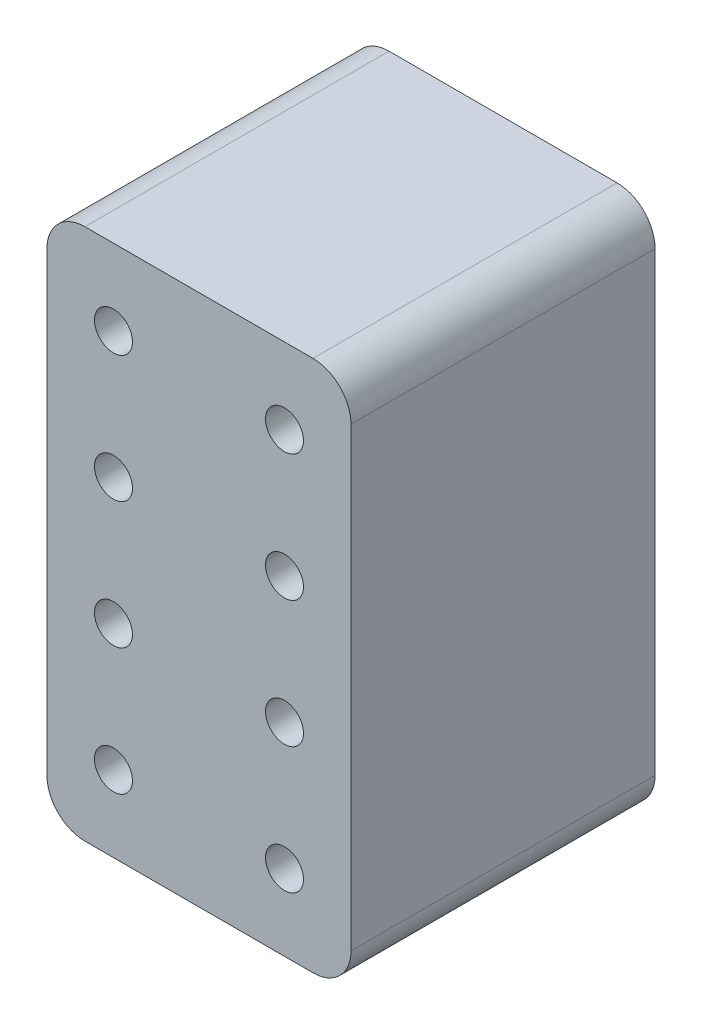
ISO-10303-21;
HEADER;
FILE_DESCRIPTION(('STEP AP214'),'2;1');
FILE_NAME('part.step','',(''),(''),'','','');
FILE_SCHEMA(('AUTOMOTIVE_DESIGN { 1 0 10303 214 1 1 1 1 }'));
ENDSEC;
DATA;
#1=APPLICATION_CONTEXT('core data for automotive mechanical design processes');
#2=APPLICATION_PROTOCOL_DEFINITION('international standard','automotive_design',2000,#1);
#3=PRODUCT_CONTEXT('',#1,'mechanical');
#4=PRODUCT('Part','Part','',(#3));
#5=PRODUCT_RELATED_PRODUCT_CATEGORY('part','',(#4));
#6=PRODUCT_DEFINITION_FORMATION('','',#4);
#7=PRODUCT_DEFINITION_CONTEXT('part definition',#1,'design');
#8=PRODUCT_DEFINITION('design','',#6,#7);
#9=PRODUCT_DEFINITION_SHAPE('','',#8);
#10=(LENGTH_UNIT() NAMED_UNIT(*) SI_UNIT(.MILLI.,.METRE.));
#11=(NAMED_UNIT(*) PLANE_ANGLE_UNIT() SI_UNIT($,.RADIAN.));
#12=(NAMED_UNIT(*) SI_UNIT($,.STERADIAN.) SOLID_ANGLE_UNIT());
#13=UNCERTAINTY_MEASURE_WITH_UNIT(LENGTH_MEASURE(1.E-05),#10,'distance_accuracy_value','');
#14=(GEOMETRIC_REPRESENTATION_CONTEXT(3) GLOBAL_UNCERTAINTY_ASSIGNED_CONTEXT((#13)) GLOBAL_UNIT_ASSIGNED_CONTEXT((#10,
#11,#12)) REPRESENTATION_CONTEXT('',''));
#15=CARTESIAN_POINT('',(0.,0.,0.));
#16=DIRECTION('',(0.,0.,1.));
#17=DIRECTION('',(1.,0.,0.));
#18=AXIS2_PLACEMENT_3D('',#15,#16,#17);
#19=CARTESIAN_POINT('',(-11.9999999999992,-24.0000000000001,32.));
#20=DIRECTION('',(0.,0.,-1.));
#21=DIRECTION('',(-1.,0.,0.));
#22=AXIS2_PLACEMENT_3D('',#19,#20,#21);
#23=PLANE('',#22);
#24=CARTESIAN_POINT('',(-11.9999999999992,-24.0000000000001,32.));
#25=DIRECTION('',(0.,0.,1.));
#26=DIRECTION('',(-1.,0.,0.));
#27=AXIS2_PLACEMENT_3D('',#24,#25,#26);
#28=CIRCLE('',#27,4.);
#29=CARTESIAN_POINT('',(-15.9999999999992,-24.0000000000001,32.));
#30=VERTEX_POINT('',#29);
#31=CARTESIAN_POINT('',(-11.9999999999991,-28.0000000000001,32.));
#32=VERTEX_POINT('',#31);
#33=EDGE_CURVE('E164',#30,#32,#28,.T.);
#34=ORIENTED_EDGE('',*,*,#33,.T.);
#35=DIRECTION('',(1.,0.,0.));
#36=VECTOR('',#35,1.);
#37=CARTESIAN_POINT('',(12.0000000000009,-27.9999999999999,32.));
#38=LINE('',#37,#36);
#39=CARTESIAN_POINT('',(12.0000000000009,-27.9999999999999,32.));
#40=VERTEX_POINT('',#39);
#41=EDGE_CURVE('E100',#32,#40,#38,.T.);
#42=ORIENTED_EDGE('',*,*,#41,.T.);
#43=CARTESIAN_POINT('',(12.0000000000008,-23.9999999999999,32.));
#44=DIRECTION('',(0.,0.,1.));
#45=DIRECTION('',(-1.,0.,0.));
#46=AXIS2_PLACEMENT_3D('',#43,#44,#45);
#47=CIRCLE('',#46,4.);
#48=CARTESIAN_POINT('',(16.0000000000008,-23.9999999999999,32.));
#49=VERTEX_POINT('',#48);
#50=EDGE_CURVE('E185',#40,#49,#47,.T.);
#51=ORIENTED_EDGE('',*,*,#50,.T.);
#52=DIRECTION('',(0.,1.,0.));
#53=VECTOR('',#52,1.);
#54=CARTESIAN_POINT('',(16.0000000000008,24.0000000000001,32.));
#55=LINE('',#54,#53);
#56=CARTESIAN_POINT('',(16.0000000000008,24.0000000000001,32.));
#57=VERTEX_POINT('',#56);
#58=EDGE_CURVE('E199',#49,#57,#55,.T.);
#59=ORIENTED_EDGE('',*,*,#58,.T.);
#60=CARTESIAN_POINT('',(12.0000000000008,24.0000000000001,32.));
#61=DIRECTION('',(0.,0.,1.));
#62=DIRECTION('',(-1.,0.,0.));
#63=AXIS2_PLACEMENT_3D('',#60,#61,#62);
#64=CIRCLE('',#63,4.);
#65=CARTESIAN_POINT('',(12.0000000000008,28.0000000000001,32.));
#66=VERTEX_POINT('',#65);
#67=EDGE_CURVE('E119',#57,#66,#64,.T.);
#68=ORIENTED_EDGE('',*,*,#67,.T.);
#69=DIRECTION('',(-1.,0.,0.));
#70=VECTOR('',#69,1.);
#71=CARTESIAN_POINT('',(12.0000000000008,28.0000000000001,32.));
#72=LINE('',#71,#70);
#73=CARTESIAN_POINT('',(-11.9999999999992,27.9999999999999,32.));
#74=VERTEX_POINT('',#73);
#75=EDGE_CURVE('E113',#66,#74,#72,.T.);
#76=ORIENTED_EDGE('',*,*,#75,.T.);
#77=CARTESIAN_POINT('',(-11.9999999999992,23.9999999999999,32.));
#78=DIRECTION('',(0.,0.,1.));
#79=DIRECTION('',(1.,0.,0.));
#80=AXIS2_PLACEMENT_3D('',#77,#78,#79);
#81=CIRCLE('',#80,4.);
#82=CARTESIAN_POINT('',(-15.9999999999992,23.9999999999999,32.));
#83=VERTEX_POINT('',#82);
#84=EDGE_CURVE('E117',#74,#83,#81,.T.);
#85=ORIENTED_EDGE('',*,*,#84,.T.);
#86=DIRECTION('',(0.,-1.,0.));
#87=VECTOR('',#86,1.);
#88=CARTESIAN_POINT('',(-15.9999999999992,23.9999999999999,32.));
#89=LINE('',#88,#87);
#90=EDGE_CURVE('E57',#83,#30,#89,.T.);
#91=ORIENTED_EDGE('',*,*,#90,.T.);
#92=EDGE_LOOP('',(#34,#42,#51,#59,#68,#76,#85,#91));
#93=FACE_BOUND('',#92,.T.);
#94=CARTESIAN_POINT('',(8.99999999999912,20.0000000000001,32.));
#95=DIRECTION('',(0.,0.,1.));
#96=DIRECTION('',(1.,0.,0.));
#97=AXIS2_PLACEMENT_3D('',#94,#95,#96);
#98=CIRCLE('',#97,2.00000000000079);
#99=CARTESIAN_POINT('',(10.9999999999999,20.0000000000001,32.));
#100=VERTEX_POINT('',#99);
#101=EDGE_CURVE('E146',#100,#100,#98,.T.);
#102=ORIENTED_EDGE('',*,*,#101,.F.);
#103=EDGE_LOOP('',(#102));
#104=FACE_BOUND('',#103,.T.);
#105=CARTESIAN_POINT('',(9.00000000000014,6.66666666666695,32.));
#106=DIRECTION('',(0.,0.,1.));
#107=DIRECTION('',(1.,0.,0.));
#108=AXIS2_PLACEMENT_3D('',#105,#106,#107);
#109=CIRCLE('',#108,2.);
#110=CARTESIAN_POINT('',(11.0000000000001,6.66666666666695,32.));
#111=VERTEX_POINT('',#110);
#112=EDGE_CURVE('E213',#111,#111,#109,.T.);
#113=ORIENTED_EDGE('',*,*,#112,.F.);
#114=EDGE_LOOP('',(#113));
#115=FACE_BOUND('',#114,.T.);
#116=CARTESIAN_POINT('',(9.00000000000028,-6.66666666666638,32.));
#117=DIRECTION('',(0.,0.,1.));
#118=DIRECTION('',(1.,0.,0.));
#119=AXIS2_PLACEMENT_3D('',#116,#117,#118);
#120=CIRCLE('',#119,2.);
#121=CARTESIAN_POINT('',(11.0000000000003,-6.66666666666638,32.));
#122=VERTEX_POINT('',#121);
#123=EDGE_CURVE('E221',#122,#122,#120,.T.);
#124=ORIENTED_EDGE('',*,*,#123,.F.);
#125=EDGE_LOOP('',(#124));
#126=FACE_BOUND('',#125,.T.);
#127=CARTESIAN_POINT('',(8.99999999999911,-19.9999999999999,32.));
#128=DIRECTION('',(0.,0.,1.));
#129=DIRECTION('',(1.,0.,0.));
#130=AXIS2_PLACEMENT_3D('',#127,#128,#129);
#131=CIRCLE('',#130,2.00000000000025);
#132=CARTESIAN_POINT('',(10.9999999999994,-19.9999999999999,32.));
#133=VERTEX_POINT('',#132);
#134=EDGE_CURVE('E229',#133,#133,#131,.T.);
#135=ORIENTED_EDGE('',*,*,#134,.F.);
#136=EDGE_LOOP('',(#135));
#137=FACE_BOUND('',#136,.T.);
#138=CARTESIAN_POINT('',(-8.99999999999937,-19.9999999999999,32.));
#139=DIRECTION('',(0.,0.,1.));
#140=DIRECTION('',(-1.,0.,0.));
#141=AXIS2_PLACEMENT_3D('',#138,#139,#140);
#142=CIRCLE('',#141,2.);
#143=CARTESIAN_POINT('',(-10.9999999999994,-19.9999999999999,32.));
#144=VERTEX_POINT('',#143);
#145=EDGE_CURVE('E237',#144,#144,#142,.T.);
#146=ORIENTED_EDGE('',*,*,#145,.F.);
#147=EDGE_LOOP('',(#146));
#148=FACE_BOUND('',#147,.T.);
#149=CARTESIAN_POINT('',(-9.00000000000028,-6.66666666666638,32.));
#150=DIRECTION('',(0.,0.,1.));
#151=DIRECTION('',(-1.,0.,0.));
#152=AXIS2_PLACEMENT_3D('',#149,#150,#151);
#153=CIRCLE('',#152,2.);
#154=CARTESIAN_POINT('',(-11.0000000000003,-6.66666666666638,32.));
#155=VERTEX_POINT('',#154);
#156=EDGE_CURVE('E245',#155,#155,#153,.T.);
#157=ORIENTED_EDGE('',*,*,#156,.F.);
#158=EDGE_LOOP('',(#157));
#159=FACE_BOUND('',#158,.T.);
#160=CARTESIAN_POINT('',(-9.00000000000014,6.66666666666695,32.));
#161=DIRECTION('',(0.,0.,1.));
#162=DIRECTION('',(-1.,0.,0.));
#163=AXIS2_PLACEMENT_3D('',#160,#161,#162);
#164=CIRCLE('',#163,2.);
#165=CARTESIAN_POINT('',(-11.0000000000001,6.66666666666695,32.));
#166=VERTEX_POINT('',#165);
#167=EDGE_CURVE('E253',#166,#166,#164,.T.);
#168=ORIENTED_EDGE('',*,*,#167,.F.);
#169=EDGE_LOOP('',(#168));
#170=FACE_BOUND('',#169,.T.);
#171=CARTESIAN_POINT('',(-9.,20.0000000000003,32.));
#172=DIRECTION('',(0.,0.,1.));
#173=DIRECTION('',(-1.,0.,0.));
#174=AXIS2_PLACEMENT_3D('',#171,#172,#173);
#175=CIRCLE('',#174,1.99999999999996);
#176=CARTESIAN_POINT('',(-11.,20.0000000000003,32.));
#177=VERTEX_POINT('',#176);
#178=EDGE_CURVE('E261',#177,#177,#175,.T.);
#179=ORIENTED_EDGE('',*,*,#178,.F.);
#180=EDGE_LOOP('',(#179));
#181=FACE_BOUND('',#180,.T.);
#182=ADVANCED_FACE('F39',(#93,#104,#115,#126,#137,#148,#159,#170,#181),#23,.F.);
#183=CARTESIAN_POINT('',(-11.9999999999992,-24.0000000000001,0.));
#184=DIRECTION('',(0.,0.,-1.));
#185=DIRECTION('',(-1.,0.,0.));
#186=AXIS2_PLACEMENT_3D('',#183,#184,#185);
#187=PLANE('',#186);
#188=CARTESIAN_POINT('',(-9.00000000000014,6.66666666666695,0.));
#189=DIRECTION('',(0.,0.,1.));
#190=DIRECTION('',(-1.,0.,0.));
#191=AXIS2_PLACEMENT_3D('',#188,#189,#190);
#192=CIRCLE('',#191,2.);
#193=CARTESIAN_POINT('',(-11.0000000000001,6.66666666666695,0.));
#194=VERTEX_POINT('',#193);
#195=EDGE_CURVE('E257',#194,#194,#192,.T.);
#196=ORIENTED_EDGE('',*,*,#195,.T.);
#197=EDGE_LOOP('',(#196));
#198=FACE_BOUND('',#197,.T.);
#199=CARTESIAN_POINT('',(-8.99999999999937,-19.9999999999999,0.));
#200=DIRECTION('',(0.,0.,1.));
#201=DIRECTION('',(-1.,0.,0.));
#202=AXIS2_PLACEMENT_3D('',#199,#200,#201);
#203=CIRCLE('',#202,2.);
#204=CARTESIAN_POINT('',(-10.9999999999994,-19.9999999999999,0.));
#205=VERTEX_POINT('',#204);
#206=EDGE_CURVE('E241',#205,#205,#203,.T.);
#207=ORIENTED_EDGE('',*,*,#206,.T.);
#208=EDGE_LOOP('',(#207));
#209=FACE_BOUND('',#208,.T.);
#210=CARTESIAN_POINT('',(9.00000000000028,-6.66666666666638,0.));
#211=DIRECTION('',(0.,0.,1.));
#212=DIRECTION('',(1.,0.,0.));
#213=AXIS2_PLACEMENT_3D('',#210,#211,#212);
#214=CIRCLE('',#213,2.);
#215=CARTESIAN_POINT('',(11.0000000000003,-6.66666666666638,0.));
#216=VERTEX_POINT('',#215);
#217=EDGE_CURVE('E225',#216,#216,#214,.T.);
#218=ORIENTED_EDGE('',*,*,#217,.T.);
#219=EDGE_LOOP('',(#218));
#220=FACE_BOUND('',#219,.T.);
#221=CARTESIAN_POINT('',(8.99999999999912,20.0000000000001,0.));
#222=DIRECTION('',(0.,0.,1.));
#223=DIRECTION('',(1.,0.,0.));
#224=AXIS2_PLACEMENT_3D('',#221,#222,#223);
#225=CIRCLE('',#224,2.00000000000079);
#226=CARTESIAN_POINT('',(10.9999999999999,20.0000000000001,0.));
#227=VERTEX_POINT('',#226);
#228=EDGE_CURVE('E209',#227,#227,#225,.T.);
#229=ORIENTED_EDGE('',*,*,#228,.T.);
#230=EDGE_LOOP('',(#229));
#231=FACE_BOUND('',#230,.T.);
#232=CARTESIAN_POINT('',(-11.9999999999992,-24.0000000000001,0.));
#233=DIRECTION('',(0.,0.,1.));
#234=DIRECTION('',(-1.,0.,0.));
#235=AXIS2_PLACEMENT_3D('',#232,#233,#234);
#236=CIRCLE('',#235,4.);
#237=CARTESIAN_POINT('',(-15.9999999999992,-24.0000000000001,0.));
#238=VERTEX_POINT('',#237);
#239=CARTESIAN_POINT('',(-11.9999999999991,-28.0000000000001,0.));
#240=VERTEX_POINT('',#239);
#241=EDGE_CURVE('E141',#238,#240,#236,.T.);
#242=ORIENTED_EDGE('',*,*,#241,.F.);
#243=DIRECTION('',(0.,-1.,0.));
#244=VECTOR('',#243,1.);
#245=CARTESIAN_POINT('',(-15.9999999999992,23.9999999999999,0.));
#246=LINE('',#245,#244);
#247=CARTESIAN_POINT('',(-15.9999999999992,23.9999999999999,0.));
#248=VERTEX_POINT('',#247);
#249=EDGE_CURVE('E92',#248,#238,#246,.T.);
#250=ORIENTED_EDGE('',*,*,#249,.F.);
#251=CARTESIAN_POINT('',(-11.9999999999992,23.9999999999999,0.));
#252=DIRECTION('',(0.,0.,1.));
#253=DIRECTION('',(1.,0.,0.));
#254=AXIS2_PLACEMENT_3D('',#251,#252,#253);
#255=CIRCLE('',#254,4.);
#256=CARTESIAN_POINT('',(-11.9999999999992,27.9999999999999,0.));
#257=VERTEX_POINT('',#256);
#258=EDGE_CURVE('E86',#257,#248,#255,.T.);
#259=ORIENTED_EDGE('',*,*,#258,.F.);
#260=DIRECTION('',(-1.,0.,0.));
#261=VECTOR('',#260,1.);
#262=CARTESIAN_POINT('',(12.0000000000008,28.0000000000001,0.));
#263=LINE('',#262,#261);
#264=CARTESIAN_POINT('',(12.0000000000008,28.0000000000001,0.));
#265=VERTEX_POINT('',#264);
#266=EDGE_CURVE('E128',#265,#257,#263,.T.);
#267=ORIENTED_EDGE('',*,*,#266,.F.);
#268=CARTESIAN_POINT('',(12.0000000000008,24.0000000000001,0.));
#269=DIRECTION('',(0.,0.,1.));
#270=DIRECTION('',(-1.,0.,0.));
#271=AXIS2_PLACEMENT_3D('',#268,#269,#270);
#272=CIRCLE('',#271,4.);
#273=CARTESIAN_POINT('',(16.0000000000008,24.0000000000001,0.));
#274=VERTEX_POINT('',#273);
#275=EDGE_CURVE('E155',#274,#265,#272,.T.);
#276=ORIENTED_EDGE('',*,*,#275,.F.);
#277=DIRECTION('',(0.,1.,0.));
#278=VECTOR('',#277,1.);
#279=CARTESIAN_POINT('',(16.0000000000008,24.0000000000001,0.));
#280=LINE('',#279,#278);
#281=CARTESIAN_POINT('',(16.0000000000008,-23.9999999999999,0.));
#282=VERTEX_POINT('',#281);
#283=EDGE_CURVE('E152',#282,#274,#280,.T.);
#284=ORIENTED_EDGE('',*,*,#283,.F.);
#285=CARTESIAN_POINT('',(12.0000000000008,-23.9999999999999,0.));
#286=DIRECTION('',(0.,0.,1.));
#287=DIRECTION('',(-1.,0.,0.));
#288=AXIS2_PLACEMENT_3D('',#285,#286,#287);
#289=CIRCLE('',#288,4.);
#290=CARTESIAN_POINT('',(12.0000000000009,-27.9999999999999,0.));
#291=VERTEX_POINT('',#290);
#292=EDGE_CURVE('E149',#291,#282,#289,.T.);
#293=ORIENTED_EDGE('',*,*,#292,.F.);
#294=DIRECTION('',(1.,0.,0.));
#295=VECTOR('',#294,1.);
#296=CARTESIAN_POINT('',(12.0000000000009,-27.9999999999999,0.));
#297=LINE('',#296,#295);
#298=EDGE_CURVE('E145',#240,#291,#297,.T.);
#299=ORIENTED_EDGE('',*,*,#298,.F.);
#300=EDGE_LOOP('',(#242,#250,#259,#267,#276,#284,#293,#299));
#301=FACE_BOUND('',#300,.T.);
#302=CARTESIAN_POINT('',(9.00000000000014,6.66666666666695,0.));
#303=DIRECTION('',(0.,0.,1.));
#304=DIRECTION('',(1.,0.,0.));
#305=AXIS2_PLACEMENT_3D('',#302,#303,#304);
#306=CIRCLE('',#305,2.);
#307=CARTESIAN_POINT('',(11.0000000000001,6.66666666666695,0.));
#308=VERTEX_POINT('',#307);
#309=EDGE_CURVE('E217',#308,#308,#306,.T.);
#310=ORIENTED_EDGE('',*,*,#309,.T.);
#311=EDGE_LOOP('',(#310));
#312=FACE_BOUND('',#311,.T.);
#313=CARTESIAN_POINT('',(8.99999999999911,-19.9999999999999,0.));
#314=DIRECTION('',(0.,0.,1.));
#315=DIRECTION('',(1.,0.,0.));
#316=AXIS2_PLACEMENT_3D('',#313,#314,#315);
#317=CIRCLE('',#316,2.00000000000025);
#318=CARTESIAN_POINT('',(10.9999999999994,-19.9999999999999,0.));
#319=VERTEX_POINT('',#318);
#320=EDGE_CURVE('E233',#319,#319,#317,.T.);
#321=ORIENTED_EDGE('',*,*,#320,.T.);
#322=EDGE_LOOP('',(#321));
#323=FACE_BOUND('',#322,.T.);
#324=CARTESIAN_POINT('',(-9.00000000000028,-6.66666666666638,0.));
#325=DIRECTION('',(0.,0.,1.));
#326=DIRECTION('',(-1.,0.,0.));
#327=AXIS2_PLACEMENT_3D('',#324,#325,#326);
#328=CIRCLE('',#327,2.);
#329=CARTESIAN_POINT('',(-11.0000000000003,-6.66666666666638,0.));
#330=VERTEX_POINT('',#329);
#331=EDGE_CURVE('E249',#330,#330,#328,.T.);
#332=ORIENTED_EDGE('',*,*,#331,.T.);
#333=EDGE_LOOP('',(#332));
#334=FACE_BOUND('',#333,.T.);
#335=CARTESIAN_POINT('',(-9.,20.0000000000003,0.));
#336=DIRECTION('',(0.,0.,1.));
#337=DIRECTION('',(-1.,0.,0.));
#338=AXIS2_PLACEMENT_3D('',#335,#336,#337);
#339=CIRCLE('',#338,1.99999999999996);
#340=CARTESIAN_POINT('',(-11.,20.0000000000003,0.));
#341=VERTEX_POINT('',#340);
#342=EDGE_CURVE('E265',#341,#341,#339,.T.);
#343=ORIENTED_EDGE('',*,*,#342,.T.);
#344=EDGE_LOOP('',(#343));
#345=FACE_BOUND('',#344,.T.);
#346=ADVANCED_FACE('F189',(#198,#209,#220,#231,#301,#312,#323,#334,#345),#187,.T.);
#347=CARTESIAN_POINT('',(-11.9999999999992,-24.0000000000001,32.));
#348=DIRECTION('',(0.,0.,-1.));
#349=DIRECTION('',(-1.,0.,0.));
#350=AXIS2_PLACEMENT_3D('',#347,#348,#349);
#351=CYLINDRICAL_SURFACE('',#350,4.);
#352=ORIENTED_EDGE('',*,*,#241,.T.);
#353=DIRECTION('',(0.,0.,-1.));
#354=VECTOR('',#353,1.);
#355=CARTESIAN_POINT('',(-11.9999999999991,-28.0000000000001,32.));
#356=LINE('',#355,#354);
#357=EDGE_CURVE('E11',#32,#240,#356,.T.);
#358=ORIENTED_EDGE('',*,*,#357,.F.);
#359=ORIENTED_EDGE('',*,*,#33,.F.);
#360=DIRECTION('',(0.,0.,-1.));
#361=VECTOR('',#360,1.);
#362=CARTESIAN_POINT('',(-15.9999999999992,-24.0000000000001,32.));
#363=LINE('',#362,#361);
#364=EDGE_CURVE('E137',#30,#238,#363,.T.);
#365=ORIENTED_EDGE('',*,*,#364,.T.);
#366=EDGE_LOOP('',(#352,#358,#359,#365));
#367=FACE_BOUND('',#366,.T.);
#368=ADVANCED_FACE('F41',(#367),#351,.T.);
#369=CARTESIAN_POINT('',(12.0000000000009,-27.9999999999999,32.));
#370=DIRECTION('',(0.,1.,0.));
#371=DIRECTION('',(-1.,0.,0.));
#372=AXIS2_PLACEMENT_3D('',#369,#370,#371);
#373=PLANE('',#372);
#374=ORIENTED_EDGE('',*,*,#298,.T.);
#375=DIRECTION('',(0.,0.,-1.));
#376=VECTOR('',#375,1.);
#377=CARTESIAN_POINT('',(12.0000000000009,-27.9999999999999,32.));
#378=LINE('',#377,#376);
#379=EDGE_CURVE('E49',#40,#291,#378,.T.);
#380=ORIENTED_EDGE('',*,*,#379,.F.);
#381=ORIENTED_EDGE('',*,*,#41,.F.);
#382=ORIENTED_EDGE('',*,*,#357,.T.);
#383=EDGE_LOOP('',(#374,#380,#381,#382));
#384=FACE_BOUND('',#383,.T.);
#385=ADVANCED_FACE('F299',(#384),#373,.F.);
#386=CARTESIAN_POINT('',(12.0000000000008,-23.9999999999999,32.));
#387=DIRECTION('',(0.,0.,-1.));
#388=DIRECTION('',(-1.,0.,0.));
#389=AXIS2_PLACEMENT_3D('',#386,#387,#388);
#390=CYLINDRICAL_SURFACE('',#389,4.);
#391=ORIENTED_EDGE('',*,*,#292,.T.);
#392=DIRECTION('',(0.,0.,-1.));
#393=VECTOR('',#392,1.);
#394=CARTESIAN_POINT('',(16.0000000000008,-23.9999999999999,32.));
#395=LINE('',#394,#393);
#396=EDGE_CURVE('E175',#49,#282,#395,.T.);
#397=ORIENTED_EDGE('',*,*,#396,.F.);
#398=ORIENTED_EDGE('',*,*,#50,.F.);
#399=ORIENTED_EDGE('',*,*,#379,.T.);
#400=EDGE_LOOP('',(#391,#397,#398,#399));
#401=FACE_BOUND('',#400,.T.);
#402=ADVANCED_FACE('F183',(#401),#390,.T.);
#403=CARTESIAN_POINT('',(16.0000000000008,24.0000000000001,32.));
#404=DIRECTION('',(-1.,0.,0.));
#405=DIRECTION('',(0.,0.,1.));
#406=AXIS2_PLACEMENT_3D('',#403,#404,#405);
#407=PLANE('',#406);
#408=ORIENTED_EDGE('',*,*,#283,.T.);
#409=DIRECTION('',(0.,0.,-1.));
#410=VECTOR('',#409,1.);
#411=CARTESIAN_POINT('',(16.0000000000008,24.0000000000001,32.));
#412=LINE('',#411,#410);
#413=EDGE_CURVE('E171',#57,#274,#412,.T.);
#414=ORIENTED_EDGE('',*,*,#413,.F.);
#415=ORIENTED_EDGE('',*,*,#58,.F.);
#416=ORIENTED_EDGE('',*,*,#396,.T.);
#417=EDGE_LOOP('',(#408,#414,#415,#416));
#418=FACE_BOUND('',#417,.T.);
#419=ADVANCED_FACE('F194',(#418),#407,.F.);
#420=CARTESIAN_POINT('',(12.0000000000008,24.0000000000001,32.));
#421=DIRECTION('',(0.,0.,-1.));
#422=DIRECTION('',(-1.,0.,0.));
#423=AXIS2_PLACEMENT_3D('',#420,#421,#422);
#424=CYLINDRICAL_SURFACE('',#423,4.);
#425=ORIENTED_EDGE('',*,*,#275,.T.);
#426=DIRECTION('',(0.,0.,-1.));
#427=VECTOR('',#426,1.);
#428=CARTESIAN_POINT('',(12.0000000000008,28.0000000000001,32.));
#429=LINE('',#428,#427);
#430=EDGE_CURVE('E130',#66,#265,#429,.T.);
#431=ORIENTED_EDGE('',*,*,#430,.F.);
#432=ORIENTED_EDGE('',*,*,#67,.F.);
#433=ORIENTED_EDGE('',*,*,#413,.T.);
#434=EDGE_LOOP('',(#425,#431,#432,#433));
#435=FACE_BOUND('',#434,.T.);
#436=ADVANCED_FACE('F197',(#435),#424,.T.);
#437=CARTESIAN_POINT('',(12.0000000000008,28.0000000000001,32.));
#438=DIRECTION('',(0.,-1.,0.));
#439=DIRECTION('',(1.,0.,0.));
#440=AXIS2_PLACEMENT_3D('',#437,#438,#439);
#441=PLANE('',#440);
#442=ORIENTED_EDGE('',*,*,#266,.T.);
#443=DIRECTION('',(0.,0.,-1.));
#444=VECTOR('',#443,1.);
#445=CARTESIAN_POINT('',(-11.9999999999992,27.9999999999999,32.));
#446=LINE('',#445,#444);
#447=EDGE_CURVE('E125',#74,#257,#446,.T.);
#448=ORIENTED_EDGE('',*,*,#447,.F.);
#449=ORIENTED_EDGE('',*,*,#75,.F.);
#450=ORIENTED_EDGE('',*,*,#430,.T.);
#451=EDGE_LOOP('',(#442,#448,#449,#450));
#452=FACE_BOUND('',#451,.T.);
#453=ADVANCED_FACE('F126',(#452),#441,.F.);
#454=CARTESIAN_POINT('',(-11.9999999999992,23.9999999999999,32.));
#455=DIRECTION('',(0.,0.,-1.));
#456=DIRECTION('',(-1.,0.,0.));
#457=AXIS2_PLACEMENT_3D('',#454,#455,#456);
#458=CYLINDRICAL_SURFACE('',#457,4.);
#459=ORIENTED_EDGE('',*,*,#258,.T.);
#460=DIRECTION('',(0.,0.,-1.));
#461=VECTOR('',#460,1.);
#462=CARTESIAN_POINT('',(-15.9999999999992,23.9999999999999,32.));
#463=LINE('',#462,#461);
#464=EDGE_CURVE('E131',#83,#248,#463,.T.);
#465=ORIENTED_EDGE('',*,*,#464,.F.);
#466=ORIENTED_EDGE('',*,*,#84,.F.);
#467=ORIENTED_EDGE('',*,*,#447,.T.);
#468=EDGE_LOOP('',(#459,#465,#466,#467));
#469=FACE_BOUND('',#468,.T.);
#470=ADVANCED_FACE('F133',(#469),#458,.T.);
#471=CARTESIAN_POINT('',(-15.9999999999992,23.9999999999999,32.));
#472=DIRECTION('',(1.,0.,0.));
#473=DIRECTION('',(0.,1.,0.));
#474=AXIS2_PLACEMENT_3D('',#471,#472,#473);
#475=PLANE('',#474);
#476=ORIENTED_EDGE('',*,*,#249,.T.);
#477=ORIENTED_EDGE('',*,*,#364,.F.);
#478=ORIENTED_EDGE('',*,*,#90,.F.);
#479=ORIENTED_EDGE('',*,*,#464,.T.);
#480=EDGE_LOOP('',(#476,#477,#478,#479));
#481=FACE_BOUND('',#480,.T.);
#482=ADVANCED_FACE('F287',(#481),#475,.F.);
#483=CARTESIAN_POINT('',(8.99999999999912,20.0000000000001,32.));
#484=DIRECTION('',(0.,0.,-1.));
#485=DIRECTION('',(-1.,0.,0.));
#486=AXIS2_PLACEMENT_3D('',#483,#484,#485);
#487=CYLINDRICAL_SURFACE('',#486,2.00000000000079);
#488=ORIENTED_EDGE('',*,*,#101,.T.);
#489=EDGE_LOOP('',(#488));
#490=FACE_BOUND('',#489,.T.);
#491=ORIENTED_EDGE('',*,*,#228,.F.);
#492=EDGE_LOOP('',(#491));
#493=FACE_BOUND('',#492,.T.);
#494=ADVANCED_FACE('F284',(#490,#493),#487,.F.);
#495=CARTESIAN_POINT('',(9.00000000000014,6.66666666666695,32.));
#496=DIRECTION('',(0.,0.,-1.));
#497=DIRECTION('',(-1.,0.,0.));
#498=AXIS2_PLACEMENT_3D('',#495,#496,#497);
#499=CYLINDRICAL_SURFACE('',#498,2.);
#500=ORIENTED_EDGE('',*,*,#112,.T.);
#501=EDGE_LOOP('',(#500));
#502=FACE_BOUND('',#501,.T.);
#503=ORIENTED_EDGE('',*,*,#309,.F.);
#504=EDGE_LOOP('',(#503));
#505=FACE_BOUND('',#504,.T.);
#506=ADVANCED_FACE('F363',(#502,#505),#499,.F.);
#507=CARTESIAN_POINT('',(9.00000000000028,-6.66666666666638,32.));
#508=DIRECTION('',(0.,0.,-1.));
#509=DIRECTION('',(-1.,0.,0.));
#510=AXIS2_PLACEMENT_3D('',#507,#508,#509);
#511=CYLINDRICAL_SURFACE('',#510,2.);
#512=ORIENTED_EDGE('',*,*,#123,.T.);
#513=EDGE_LOOP('',(#512));
#514=FACE_BOUND('',#513,.T.);
#515=ORIENTED_EDGE('',*,*,#217,.F.);
#516=EDGE_LOOP('',(#515));
#517=FACE_BOUND('',#516,.T.);
#518=ADVANCED_FACE('F371',(#514,#517),#511,.F.);
#519=CARTESIAN_POINT('',(8.99999999999911,-19.9999999999999,32.));
#520=DIRECTION('',(0.,0.,-1.));
#521=DIRECTION('',(-1.,0.,0.));
#522=AXIS2_PLACEMENT_3D('',#519,#520,#521);
#523=CYLINDRICAL_SURFACE('',#522,2.00000000000025);
#524=ORIENTED_EDGE('',*,*,#134,.T.);
#525=EDGE_LOOP('',(#524));
#526=FACE_BOUND('',#525,.T.);
#527=ORIENTED_EDGE('',*,*,#320,.F.);
#528=EDGE_LOOP('',(#527));
#529=FACE_BOUND('',#528,.T.);
#530=ADVANCED_FACE('F379',(#526,#529),#523,.F.);
#531=CARTESIAN_POINT('',(-8.99999999999937,-19.9999999999999,32.));
#532=DIRECTION('',(0.,0.,-1.));
#533=DIRECTION('',(-1.,0.,0.));
#534=AXIS2_PLACEMENT_3D('',#531,#532,#533);
#535=CYLINDRICAL_SURFACE('',#534,2.);
#536=ORIENTED_EDGE('',*,*,#145,.T.);
#537=EDGE_LOOP('',(#536));
#538=FACE_BOUND('',#537,.T.);
#539=ORIENTED_EDGE('',*,*,#206,.F.);
#540=EDGE_LOOP('',(#539));
#541=FACE_BOUND('',#540,.T.);
#542=ADVANCED_FACE('F388',(#538,#541),#535,.F.);
#543=CARTESIAN_POINT('',(-9.00000000000028,-6.66666666666638,32.));
#544=DIRECTION('',(0.,0.,-1.));
#545=DIRECTION('',(-1.,0.,0.));
#546=AXIS2_PLACEMENT_3D('',#543,#544,#545);
#547=CYLINDRICAL_SURFACE('',#546,2.);
#548=ORIENTED_EDGE('',*,*,#156,.T.);
#549=EDGE_LOOP('',(#548));
#550=FACE_BOUND('',#549,.T.);
#551=ORIENTED_EDGE('',*,*,#331,.F.);
#552=EDGE_LOOP('',(#551));
#553=FACE_BOUND('',#552,.T.);
#554=ADVANCED_FACE('F397',(#550,#553),#547,.F.);
#555=CARTESIAN_POINT('',(-9.00000000000014,6.66666666666695,32.));
#556=DIRECTION('',(0.,0.,-1.));
#557=DIRECTION('',(-1.,0.,0.));
#558=AXIS2_PLACEMENT_3D('',#555,#556,#557);
#559=CYLINDRICAL_SURFACE('',#558,2.);
#560=ORIENTED_EDGE('',*,*,#167,.T.);
#561=EDGE_LOOP('',(#560));
#562=FACE_BOUND('',#561,.T.);
#563=ORIENTED_EDGE('',*,*,#195,.F.);
#564=EDGE_LOOP('',(#563));
#565=FACE_BOUND('',#564,.T.);
#566=ADVANCED_FACE('F406',(#562,#565),#559,.F.);
#567=CARTESIAN_POINT('',(-9.,20.0000000000003,32.));
#568=DIRECTION('',(0.,0.,-1.));
#569=DIRECTION('',(-1.,0.,0.));
#570=AXIS2_PLACEMENT_3D('',#567,#568,#569);
#571=CYLINDRICAL_SURFACE('',#570,1.99999999999996);
#572=ORIENTED_EDGE('',*,*,#178,.T.);
#573=EDGE_LOOP('',(#572));
#574=FACE_BOUND('',#573,.T.);
#575=ORIENTED_EDGE('',*,*,#342,.F.);
#576=EDGE_LOOP('',(#575));
#577=FACE_BOUND('',#576,.T.);
#578=ADVANCED_FACE('F273',(#574,#577),#571,.F.);
#579=CLOSED_SHELL('',(#182,#346,#368,#385,#402,#419,#436,#453,#470,#482,#494,#506,#518,#530,
#542,#554,#566,#578));
#580=MANIFOLD_SOLID_BREP('B2',#579);
#581=ADVANCED_BREP_SHAPE_REPRESENTATION('',(#18,#580),#14);
#582=SHAPE_DEFINITION_REPRESENTATION(#9,#581);
ENDSEC;
END-ISO-10303-21;
